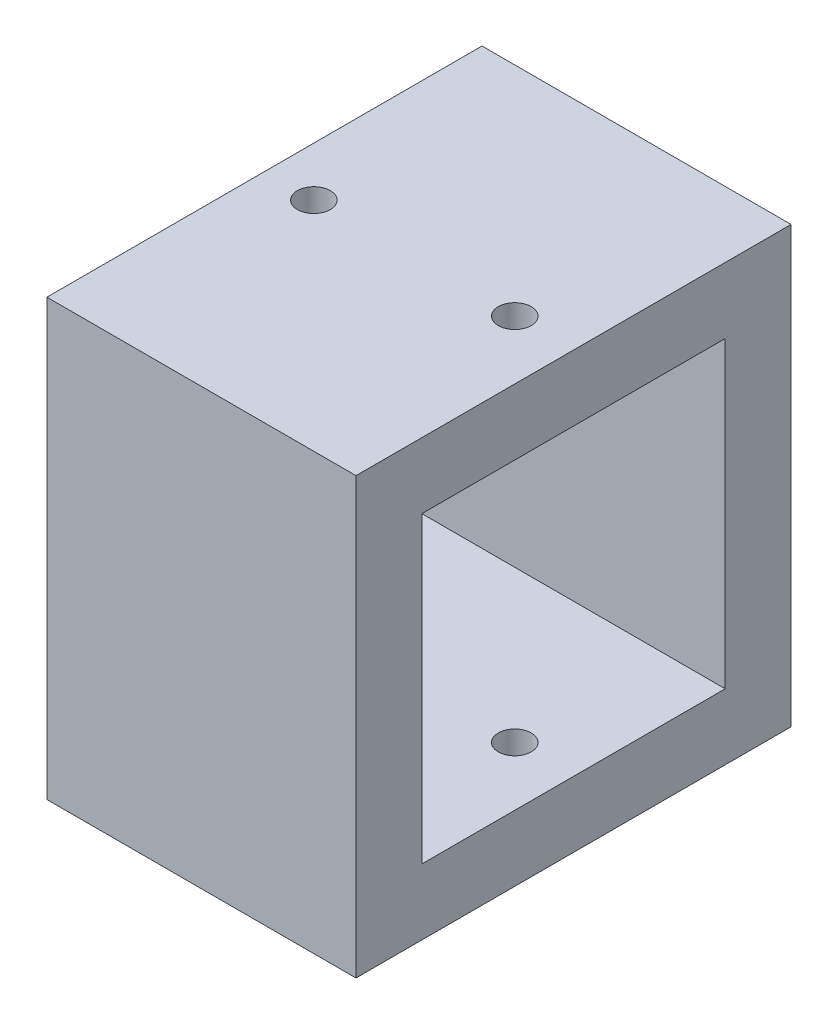
ISO-10303-21;
HEADER;
FILE_DESCRIPTION(('STEP AP214'),'2;1');
FILE_NAME('part.step','',(''),(''),'','','');
FILE_SCHEMA(('AUTOMOTIVE_DESIGN { 1 0 10303 214 1 1 1 1 }'));
ENDSEC;
DATA;
#1=APPLICATION_CONTEXT('core data for automotive mechanical design processes');
#2=APPLICATION_PROTOCOL_DEFINITION('international standard','automotive_design',2000,#1);
#3=PRODUCT_CONTEXT('',#1,'mechanical');
#4=PRODUCT('Part','Part','',(#3));
#5=PRODUCT_RELATED_PRODUCT_CATEGORY('part','',(#4));
#6=PRODUCT_DEFINITION_FORMATION('','',#4);
#7=PRODUCT_DEFINITION_CONTEXT('part definition',#1,'design');
#8=PRODUCT_DEFINITION('design','',#6,#7);
#9=PRODUCT_DEFINITION_SHAPE('','',#8);
#10=(LENGTH_UNIT() NAMED_UNIT(*) SI_UNIT(.MILLI.,.METRE.));
#11=(NAMED_UNIT(*) PLANE_ANGLE_UNIT() SI_UNIT($,.RADIAN.));
#12=(NAMED_UNIT(*) SI_UNIT($,.STERADIAN.) SOLID_ANGLE_UNIT());
#13=UNCERTAINTY_MEASURE_WITH_UNIT(LENGTH_MEASURE(1.E-05),#10,'distance_accuracy_value','');
#14=(GEOMETRIC_REPRESENTATION_CONTEXT(3) GLOBAL_UNCERTAINTY_ASSIGNED_CONTEXT((#13)) GLOBAL_UNIT_ASSIGNED_CONTEXT((#10,
#11,#12)) REPRESENTATION_CONTEXT('',''));
#15=CARTESIAN_POINT('',(0.,0.,0.));
#16=DIRECTION('',(0.,0.,1.));
#17=DIRECTION('',(1.,0.,0.));
#18=AXIS2_PLACEMENT_3D('',#15,#16,#17);
#19=CARTESIAN_POINT('',(23.837801194,0.,0.));
#20=DIRECTION('',(-1.,0.,0.));
#21=DIRECTION('',(0.,0.,1.));
#22=AXIS2_PLACEMENT_3D('',#19,#20,#21);
#23=PLANE('',#22);
#24=DIRECTION('',(0.,1.,0.));
#25=VECTOR('',#24,1.);
#26=CARTESIAN_POINT('',(23.837801194,-8.95940660455442,-18.717741186585));
#27=LINE('',#26,#25);
#28=CARTESIAN_POINT('',(23.837801194,-8.95940660455442,-18.717741186585));
#29=VERTEX_POINT('',#28);
#30=CARTESIAN_POINT('',(23.837801194,24.5955684494456,-18.717741186585));
#31=VERTEX_POINT('',#30);
#32=EDGE_CURVE('E142',#29,#31,#27,.T.);
#33=ORIENTED_EDGE('',*,*,#32,.T.);
#34=DIRECTION('',(0.,0.,1.));
#35=VECTOR('',#34,1.);
#36=CARTESIAN_POINT('',(23.837801194,24.5955684494456,14.837233867415));
#37=LINE('',#36,#35);
#38=CARTESIAN_POINT('',(23.837801194,24.5955684494456,14.837233867415));
#39=VERTEX_POINT('',#38);
#40=EDGE_CURVE('E145',#31,#39,#37,.T.);
#41=ORIENTED_EDGE('',*,*,#40,.T.);
#42=DIRECTION('',(0.,-1.,0.));
#43=VECTOR('',#42,1.);
#44=CARTESIAN_POINT('',(23.837801194,-8.95940660455442,14.837233867415));
#45=LINE('',#44,#43);
#46=CARTESIAN_POINT('',(23.837801194,-8.95940660455442,14.837233867415));
#47=VERTEX_POINT('',#46);
#48=EDGE_CURVE('E148',#39,#47,#45,.T.);
#49=ORIENTED_EDGE('',*,*,#48,.T.);
#50=DIRECTION('',(0.,0.,-1.));
#51=VECTOR('',#50,1.);
#52=CARTESIAN_POINT('',(23.837801194,-8.95940660455442,14.837233867415));
#53=LINE('',#52,#51);
#54=EDGE_CURVE('E150',#47,#29,#53,.T.);
#55=ORIENTED_EDGE('',*,*,#54,.T.);
#56=EDGE_LOOP('',(#33,#41,#49,#55));
#57=FACE_BOUND('',#56,.T.);
#58=DIRECTION('',(0.,1.,0.));
#59=VECTOR('',#58,1.);
#60=CARTESIAN_POINT('',(23.837801194,-3.87940660455442,-13.637741186585));
#61=LINE('',#60,#59);
#62=CARTESIAN_POINT('',(23.837801194,-3.87940660455442,-13.637741186585));
#63=VERTEX_POINT('',#62);
#64=CARTESIAN_POINT('',(23.837801194,19.5155684494456,-13.637741186585));
#65=VERTEX_POINT('',#64);
#66=EDGE_CURVE('E104',#63,#65,#61,.T.);
#67=ORIENTED_EDGE('',*,*,#66,.F.);
#68=DIRECTION('',(0.,0.,-1.));
#69=VECTOR('',#68,1.);
#70=CARTESIAN_POINT('',(23.837801194,-3.87940660455442,9.75723386741496));
#71=LINE('',#70,#69);
#72=CARTESIAN_POINT('',(23.837801194,-3.87940660455442,9.75723386741496));
#73=VERTEX_POINT('',#72);
#74=EDGE_CURVE('E126',#73,#63,#71,.T.);
#75=ORIENTED_EDGE('',*,*,#74,.F.);
#76=DIRECTION('',(0.,-1.,0.));
#77=VECTOR('',#76,1.);
#78=CARTESIAN_POINT('',(23.837801194,-3.87940660455442,9.75723386741496));
#79=LINE('',#78,#77);
#80=CARTESIAN_POINT('',(23.837801194,19.5155684494456,9.75723386741496));
#81=VERTEX_POINT('',#80);
#82=EDGE_CURVE('E124',#81,#73,#79,.T.);
#83=ORIENTED_EDGE('',*,*,#82,.F.);
#84=DIRECTION('',(0.,0.,1.));
#85=VECTOR('',#84,1.);
#86=CARTESIAN_POINT('',(23.837801194,19.5155684494456,9.75723386741496));
#87=LINE('',#86,#85);
#88=EDGE_CURVE('E112',#65,#81,#87,.T.);
#89=ORIENTED_EDGE('',*,*,#88,.F.);
#90=EDGE_LOOP('',(#67,#75,#83,#89));
#91=FACE_BOUND('',#90,.T.);
#92=ADVANCED_FACE('F37',(#57,#91),#23,.F.);
#93=CARTESIAN_POINT('',(0.,0.,0.));
#94=DIRECTION('',(-1.,0.,0.));
#95=DIRECTION('',(0.,0.,1.));
#96=AXIS2_PLACEMENT_3D('',#93,#94,#95);
#97=PLANE('',#96);
#98=DIRECTION('',(0.,1.,0.));
#99=VECTOR('',#98,1.);
#100=CARTESIAN_POINT('',(0.,-8.95940660455442,-18.717741186585));
#101=LINE('',#100,#99);
#102=CARTESIAN_POINT('',(0.,-8.95940660455442,-18.717741186585));
#103=VERTEX_POINT('',#102);
#104=CARTESIAN_POINT('',(0.,24.5955684494456,-18.717741186585));
#105=VERTEX_POINT('',#104);
#106=EDGE_CURVE('E120',#103,#105,#101,.T.);
#107=ORIENTED_EDGE('',*,*,#106,.F.);
#108=DIRECTION('',(0.,0.,-1.));
#109=VECTOR('',#108,1.);
#110=CARTESIAN_POINT('',(0.,-8.95940660455442,14.837233867415));
#111=LINE('',#110,#109);
#112=CARTESIAN_POINT('',(0.,-8.95940660455442,14.837233867415));
#113=VERTEX_POINT('',#112);
#114=EDGE_CURVE('E146',#113,#103,#111,.T.);
#115=ORIENTED_EDGE('',*,*,#114,.F.);
#116=DIRECTION('',(0.,-1.,0.));
#117=VECTOR('',#116,1.);
#118=CARTESIAN_POINT('',(0.,-8.95940660455442,14.837233867415));
#119=LINE('',#118,#117);
#120=CARTESIAN_POINT('',(0.,24.5955684494456,14.837233867415));
#121=VERTEX_POINT('',#120);
#122=EDGE_CURVE('E157',#121,#113,#119,.T.);
#123=ORIENTED_EDGE('',*,*,#122,.F.);
#124=DIRECTION('',(0.,0.,1.));
#125=VECTOR('',#124,1.);
#126=CARTESIAN_POINT('',(0.,24.5955684494456,14.837233867415));
#127=LINE('',#126,#125);
#128=EDGE_CURVE('E155',#105,#121,#127,.T.);
#129=ORIENTED_EDGE('',*,*,#128,.F.);
#130=EDGE_LOOP('',(#107,#115,#123,#129));
#131=FACE_BOUND('',#130,.T.);
#132=DIRECTION('',(0.,0.,-1.));
#133=VECTOR('',#132,1.);
#134=CARTESIAN_POINT('',(0.,-3.87940660455442,9.75723386741496));
#135=LINE('',#134,#133);
#136=CARTESIAN_POINT('',(0.,-3.87940660455442,9.75723386741496));
#137=VERTEX_POINT('',#136);
#138=CARTESIAN_POINT('',(0.,-3.87940660455442,-13.637741186585));
#139=VERTEX_POINT('',#138);
#140=EDGE_CURVE('E113',#137,#139,#135,.T.);
#141=ORIENTED_EDGE('',*,*,#140,.T.);
#142=DIRECTION('',(0.,1.,0.));
#143=VECTOR('',#142,1.);
#144=CARTESIAN_POINT('',(0.,-3.87940660455442,-13.637741186585));
#145=LINE('',#144,#143);
#146=CARTESIAN_POINT('',(0.,19.5155684494456,-13.637741186585));
#147=VERTEX_POINT('',#146);
#148=EDGE_CURVE('E62',#139,#147,#145,.T.);
#149=ORIENTED_EDGE('',*,*,#148,.T.);
#150=DIRECTION('',(0.,0.,1.));
#151=VECTOR('',#150,1.);
#152=CARTESIAN_POINT('',(0.,19.5155684494456,9.75723386741496));
#153=LINE('',#152,#151);
#154=CARTESIAN_POINT('',(0.,19.5155684494456,9.75723386741496));
#155=VERTEX_POINT('',#154);
#156=EDGE_CURVE('E119',#147,#155,#153,.T.);
#157=ORIENTED_EDGE('',*,*,#156,.T.);
#158=DIRECTION('',(0.,-1.,0.));
#159=VECTOR('',#158,1.);
#160=CARTESIAN_POINT('',(0.,-3.87940660455442,9.75723386741496));
#161=LINE('',#160,#159);
#162=EDGE_CURVE('E134',#155,#137,#161,.T.);
#163=ORIENTED_EDGE('',*,*,#162,.T.);
#164=EDGE_LOOP('',(#141,#149,#157,#163));
#165=FACE_BOUND('',#164,.T.);
#166=ADVANCED_FACE('F204',(#131,#165),#97,.T.);
#167=CARTESIAN_POINT('',(23.837801194,-8.95940660455442,-18.717741186585));
#168=DIRECTION('',(0.,0.,1.));
#169=DIRECTION('',(1.,0.,0.));
#170=AXIS2_PLACEMENT_3D('',#167,#168,#169);
#171=PLANE('',#170);
#172=ORIENTED_EDGE('',*,*,#106,.T.);
#173=DIRECTION('',(-1.,0.,0.));
#174=VECTOR('',#173,1.);
#175=CARTESIAN_POINT('',(23.837801194,24.5955684494456,-18.717741186585));
#176=LINE('',#175,#174);
#177=EDGE_CURVE('E11',#31,#105,#176,.T.);
#178=ORIENTED_EDGE('',*,*,#177,.F.);
#179=ORIENTED_EDGE('',*,*,#32,.F.);
#180=DIRECTION('',(-1.,0.,0.));
#181=VECTOR('',#180,1.);
#182=CARTESIAN_POINT('',(23.837801194,-8.95940660455442,-18.717741186585));
#183=LINE('',#182,#181);
#184=EDGE_CURVE('E152',#29,#103,#183,.T.);
#185=ORIENTED_EDGE('',*,*,#184,.T.);
#186=EDGE_LOOP('',(#172,#178,#179,#185));
#187=FACE_BOUND('',#186,.T.);
#188=ADVANCED_FACE('F39',(#187),#171,.F.);
#189=CARTESIAN_POINT('',(23.837801194,24.5955684494456,14.837233867415));
#190=DIRECTION('',(0.,-1.,0.));
#191=DIRECTION('',(0.,0.,-1.));
#192=AXIS2_PLACEMENT_3D('',#189,#190,#191);
#193=PLANE('',#192);
#194=CARTESIAN_POINT('',(3.81,24.5955684494456,-1.94025365958503));
#195=DIRECTION('',(0.,-1.,0.));
#196=DIRECTION('',(0.,0.,-1.));
#197=AXIS2_PLACEMENT_3D('',#194,#195,#196);
#198=CIRCLE('',#197,1.27);
#199=CARTESIAN_POINT('',(3.81,24.5955684494456,-3.21025365958503));
#200=VERTEX_POINT('',#199);
#201=EDGE_CURVE('E169',#200,#200,#198,.T.);
#202=ORIENTED_EDGE('',*,*,#201,.T.);
#203=EDGE_LOOP('',(#202));
#204=FACE_BOUND('',#203,.T.);
#205=CARTESIAN_POINT('',(19.304,24.5955684494456,-1.94025365958504));
#206=DIRECTION('',(0.,-1.,0.));
#207=DIRECTION('',(0.,0.,-1.));
#208=AXIS2_PLACEMENT_3D('',#205,#206,#207);
#209=CIRCLE('',#208,1.26999999999998);
#210=CARTESIAN_POINT('',(19.304,24.5955684494456,-3.21025365958501));
#211=VERTEX_POINT('',#210);
#212=EDGE_CURVE('E185',#211,#211,#209,.T.);
#213=ORIENTED_EDGE('',*,*,#212,.T.);
#214=EDGE_LOOP('',(#213));
#215=FACE_BOUND('',#214,.T.);
#216=ORIENTED_EDGE('',*,*,#128,.T.);
#217=DIRECTION('',(-1.,0.,0.));
#218=VECTOR('',#217,1.);
#219=CARTESIAN_POINT('',(23.837801194,24.5955684494456,14.837233867415));
#220=LINE('',#219,#218);
#221=EDGE_CURVE('E46',#39,#121,#220,.T.);
#222=ORIENTED_EDGE('',*,*,#221,.F.);
#223=ORIENTED_EDGE('',*,*,#40,.F.);
#224=ORIENTED_EDGE('',*,*,#177,.T.);
#225=EDGE_LOOP('',(#216,#222,#223,#224));
#226=FACE_BOUND('',#225,.T.);
#227=ADVANCED_FACE('F229',(#204,#215,#226),#193,.F.);
#228=CARTESIAN_POINT('',(23.837801194,-8.95940660455442,14.837233867415));
#229=DIRECTION('',(0.,0.,-1.));
#230=DIRECTION('',(-1.,0.,0.));
#231=AXIS2_PLACEMENT_3D('',#228,#229,#230);
#232=PLANE('',#231);
#233=ORIENTED_EDGE('',*,*,#122,.T.);
#234=DIRECTION('',(-1.,0.,0.));
#235=VECTOR('',#234,1.);
#236=CARTESIAN_POINT('',(23.837801194,-8.95940660455442,14.837233867415));
#237=LINE('',#236,#235);
#238=EDGE_CURVE('E162',#47,#113,#237,.T.);
#239=ORIENTED_EDGE('',*,*,#238,.F.);
#240=ORIENTED_EDGE('',*,*,#48,.F.);
#241=ORIENTED_EDGE('',*,*,#221,.T.);
#242=EDGE_LOOP('',(#233,#239,#240,#241));
#243=FACE_BOUND('',#242,.T.);
#244=ADVANCED_FACE('F226',(#243),#232,.F.);
#245=CARTESIAN_POINT('',(23.837801194,-8.95940660455442,14.837233867415));
#246=DIRECTION('',(0.,1.,0.));
#247=DIRECTION('',(0.,0.,1.));
#248=AXIS2_PLACEMENT_3D('',#245,#246,#247);
#249=PLANE('',#248);
#250=CARTESIAN_POINT('',(3.81,-8.95940660455442,-1.94025365958504));
#251=DIRECTION('',(0.,-1.,0.));
#252=DIRECTION('',(0.,0.,-1.));
#253=AXIS2_PLACEMENT_3D('',#250,#251,#252);
#254=CIRCLE('',#253,1.27);
#255=CARTESIAN_POINT('',(3.81,-8.95940660455442,-3.21025365958504));
#256=VERTEX_POINT('',#255);
#257=EDGE_CURVE('E175',#256,#256,#254,.T.);
#258=ORIENTED_EDGE('',*,*,#257,.F.);
#259=EDGE_LOOP('',(#258));
#260=FACE_BOUND('',#259,.T.);
#261=CARTESIAN_POINT('',(19.304,-8.95940660455442,-1.94025365958504));
#262=DIRECTION('',(0.,-1.,0.));
#263=DIRECTION('',(0.,0.,-1.));
#264=AXIS2_PLACEMENT_3D('',#261,#262,#263);
#265=CIRCLE('',#264,1.26999999999998);
#266=CARTESIAN_POINT('',(19.304,-8.95940660455442,-3.21025365958502));
#267=VERTEX_POINT('',#266);
#268=EDGE_CURVE('E180',#267,#267,#265,.T.);
#269=ORIENTED_EDGE('',*,*,#268,.F.);
#270=EDGE_LOOP('',(#269));
#271=FACE_BOUND('',#270,.T.);
#272=ORIENTED_EDGE('',*,*,#114,.T.);
#273=ORIENTED_EDGE('',*,*,#184,.F.);
#274=ORIENTED_EDGE('',*,*,#54,.F.);
#275=ORIENTED_EDGE('',*,*,#238,.T.);
#276=EDGE_LOOP('',(#272,#273,#274,#275));
#277=FACE_BOUND('',#276,.T.);
#278=ADVANCED_FACE('F223',(#260,#271,#277),#249,.F.);
#279=CARTESIAN_POINT('',(23.837801194,-3.87940660455442,-13.637741186585));
#280=DIRECTION('',(0.,0.,1.));
#281=DIRECTION('',(1.,0.,0.));
#282=AXIS2_PLACEMENT_3D('',#279,#280,#281);
#283=PLANE('',#282);
#284=ORIENTED_EDGE('',*,*,#148,.F.);
#285=DIRECTION('',(-1.,0.,0.));
#286=VECTOR('',#285,1.);
#287=CARTESIAN_POINT('',(23.837801194,-3.87940660455442,-13.637741186585));
#288=LINE('',#287,#286);
#289=EDGE_CURVE('E108',#63,#139,#288,.T.);
#290=ORIENTED_EDGE('',*,*,#289,.F.);
#291=ORIENTED_EDGE('',*,*,#66,.T.);
#292=DIRECTION('',(-1.,0.,0.));
#293=VECTOR('',#292,1.);
#294=CARTESIAN_POINT('',(23.837801194,19.5155684494456,-13.637741186585));
#295=LINE('',#294,#293);
#296=EDGE_CURVE('E107',#65,#147,#295,.T.);
#297=ORIENTED_EDGE('',*,*,#296,.T.);
#298=EDGE_LOOP('',(#284,#290,#291,#297));
#299=FACE_BOUND('',#298,.T.);
#300=ADVANCED_FACE('F106',(#299),#283,.T.);
#301=CARTESIAN_POINT('',(23.837801194,19.5155684494456,9.75723386741496));
#302=DIRECTION('',(0.,-1.,0.));
#303=DIRECTION('',(0.,0.,-1.));
#304=AXIS2_PLACEMENT_3D('',#301,#302,#303);
#305=PLANE('',#304);
#306=CARTESIAN_POINT('',(3.81,19.5155684494456,-1.94025365958504));
#307=DIRECTION('',(0.,-1.,0.));
#308=DIRECTION('',(0.,0.,-1.));
#309=AXIS2_PLACEMENT_3D('',#306,#307,#308);
#310=CIRCLE('',#309,1.27);
#311=CARTESIAN_POINT('',(3.81,19.5155684494456,-3.21025365958504));
#312=VERTEX_POINT('',#311);
#313=EDGE_CURVE('E132',#312,#312,#310,.T.);
#314=ORIENTED_EDGE('',*,*,#313,.F.);
#315=EDGE_LOOP('',(#314));
#316=FACE_BOUND('',#315,.T.);
#317=CARTESIAN_POINT('',(19.304,19.5155684494456,-1.94025365958504));
#318=DIRECTION('',(0.,-1.,0.));
#319=DIRECTION('',(0.,0.,-1.));
#320=AXIS2_PLACEMENT_3D('',#317,#318,#319);
#321=CIRCLE('',#320,1.26999999999998);
#322=CARTESIAN_POINT('',(19.304,19.5155684494456,-3.21025365958501));
#323=VERTEX_POINT('',#322);
#324=EDGE_CURVE('E168',#323,#323,#321,.T.);
#325=ORIENTED_EDGE('',*,*,#324,.F.);
#326=EDGE_LOOP('',(#325));
#327=FACE_BOUND('',#326,.T.);
#328=ORIENTED_EDGE('',*,*,#156,.F.);
#329=ORIENTED_EDGE('',*,*,#296,.F.);
#330=ORIENTED_EDGE('',*,*,#88,.T.);
#331=DIRECTION('',(-1.,0.,0.));
#332=VECTOR('',#331,1.);
#333=CARTESIAN_POINT('',(23.837801194,19.5155684494456,9.75723386741496));
#334=LINE('',#333,#332);
#335=EDGE_CURVE('E121',#81,#155,#334,.T.);
#336=ORIENTED_EDGE('',*,*,#335,.T.);
#337=EDGE_LOOP('',(#328,#329,#330,#336));
#338=FACE_BOUND('',#337,.T.);
#339=ADVANCED_FACE('F116',(#316,#327,#338),#305,.T.);
#340=CARTESIAN_POINT('',(23.837801194,-3.87940660455442,9.75723386741496));
#341=DIRECTION('',(0.,0.,-1.));
#342=DIRECTION('',(-1.,0.,0.));
#343=AXIS2_PLACEMENT_3D('',#340,#341,#342);
#344=PLANE('',#343);
#345=ORIENTED_EDGE('',*,*,#162,.F.);
#346=ORIENTED_EDGE('',*,*,#335,.F.);
#347=ORIENTED_EDGE('',*,*,#82,.T.);
#348=DIRECTION('',(-1.,0.,0.));
#349=VECTOR('',#348,1.);
#350=CARTESIAN_POINT('',(23.837801194,-3.87940660455442,9.75723386741496));
#351=LINE('',#350,#349);
#352=EDGE_CURVE('E54',#73,#137,#351,.T.);
#353=ORIENTED_EDGE('',*,*,#352,.T.);
#354=EDGE_LOOP('',(#345,#346,#347,#353));
#355=FACE_BOUND('',#354,.T.);
#356=ADVANCED_FACE('F200',(#355),#344,.T.);
#357=CARTESIAN_POINT('',(23.837801194,-3.87940660455442,9.75723386741496));
#358=DIRECTION('',(0.,1.,0.));
#359=DIRECTION('',(0.,0.,1.));
#360=AXIS2_PLACEMENT_3D('',#357,#358,#359);
#361=PLANE('',#360);
#362=CARTESIAN_POINT('',(3.81,-3.87940660455442,-1.94025365958504));
#363=DIRECTION('',(0.,1.,0.));
#364=DIRECTION('',(0.,0.,1.));
#365=AXIS2_PLACEMENT_3D('',#362,#363,#364);
#366=CIRCLE('',#365,1.27);
#367=CARTESIAN_POINT('',(3.81,-3.87940660455442,-0.67025365958504));
#368=VERTEX_POINT('',#367);
#369=EDGE_CURVE('E41',#368,#368,#366,.T.);
#370=ORIENTED_EDGE('',*,*,#369,.F.);
#371=EDGE_LOOP('',(#370));
#372=FACE_BOUND('',#371,.T.);
#373=CARTESIAN_POINT('',(19.304,-3.87940660455442,-1.94025365958504));
#374=DIRECTION('',(0.,1.,0.));
#375=DIRECTION('',(0.,0.,1.));
#376=AXIS2_PLACEMENT_3D('',#373,#374,#375);
#377=CIRCLE('',#376,1.26999999999998);
#378=CARTESIAN_POINT('',(19.304,-3.87940660455442,-0.670253659585065));
#379=VERTEX_POINT('',#378);
#380=EDGE_CURVE('E166',#379,#379,#377,.T.);
#381=ORIENTED_EDGE('',*,*,#380,.F.);
#382=EDGE_LOOP('',(#381));
#383=FACE_BOUND('',#382,.T.);
#384=ORIENTED_EDGE('',*,*,#140,.F.);
#385=ORIENTED_EDGE('',*,*,#352,.F.);
#386=ORIENTED_EDGE('',*,*,#74,.T.);
#387=ORIENTED_EDGE('',*,*,#289,.T.);
#388=EDGE_LOOP('',(#384,#385,#386,#387));
#389=FACE_BOUND('',#388,.T.);
#390=ADVANCED_FACE('F196',(#372,#383,#389),#361,.T.);
#391=CARTESIAN_POINT('',(19.304,24.5955684494456,-1.94025365958504));
#392=DIRECTION('',(0.,-1.,0.));
#393=DIRECTION('',(0.,0.,-1.));
#394=AXIS2_PLACEMENT_3D('',#391,#392,#393);
#395=CYLINDRICAL_SURFACE('',#394,1.26999999999998);
#396=ORIENTED_EDGE('',*,*,#380,.T.);
#397=EDGE_LOOP('',(#396));
#398=FACE_BOUND('',#397,.T.);
#399=ORIENTED_EDGE('',*,*,#268,.T.);
#400=EDGE_LOOP('',(#399));
#401=FACE_BOUND('',#400,.T.);
#402=ADVANCED_FACE('F199',(#398,#401),#395,.F.);
#403=CARTESIAN_POINT('',(3.81,24.5955684494456,-1.94025365958503));
#404=DIRECTION('',(0.,-1.,0.));
#405=DIRECTION('',(0.,0.,-1.));
#406=AXIS2_PLACEMENT_3D('',#403,#404,#405);
#407=CYLINDRICAL_SURFACE('',#406,1.27);
#408=ORIENTED_EDGE('',*,*,#369,.T.);
#409=EDGE_LOOP('',(#408));
#410=FACE_BOUND('',#409,.T.);
#411=ORIENTED_EDGE('',*,*,#257,.T.);
#412=EDGE_LOOP('',(#411));
#413=FACE_BOUND('',#412,.T.);
#414=ADVANCED_FACE('F193',(#410,#413),#407,.F.);
#415=ORIENTED_EDGE('',*,*,#324,.T.);
#416=EDGE_LOOP('',(#415));
#417=FACE_BOUND('',#416,.T.);
#418=ORIENTED_EDGE('',*,*,#212,.F.);
#419=EDGE_LOOP('',(#418));
#420=FACE_BOUND('',#419,.T.);
#421=ADVANCED_FACE('F251',(#417,#420),#395,.F.);
#422=ORIENTED_EDGE('',*,*,#313,.T.);
#423=EDGE_LOOP('',(#422));
#424=FACE_BOUND('',#423,.T.);
#425=ORIENTED_EDGE('',*,*,#201,.F.);
#426=EDGE_LOOP('',(#425));
#427=FACE_BOUND('',#426,.T.);
#428=ADVANCED_FACE('F253',(#424,#427),#407,.F.);
#429=CLOSED_SHELL('',(#92,#166,#188,#227,#244,#278,#300,#339,#356,#390,#402,#414,#421,#428));
#430=MANIFOLD_SOLID_BREP('B2',#429);
#431=ADVANCED_BREP_SHAPE_REPRESENTATION('',(#18,#430),#14);
#432=SHAPE_DEFINITION_REPRESENTATION(#9,#431);
ENDSEC;
END-ISO-10303-21;
